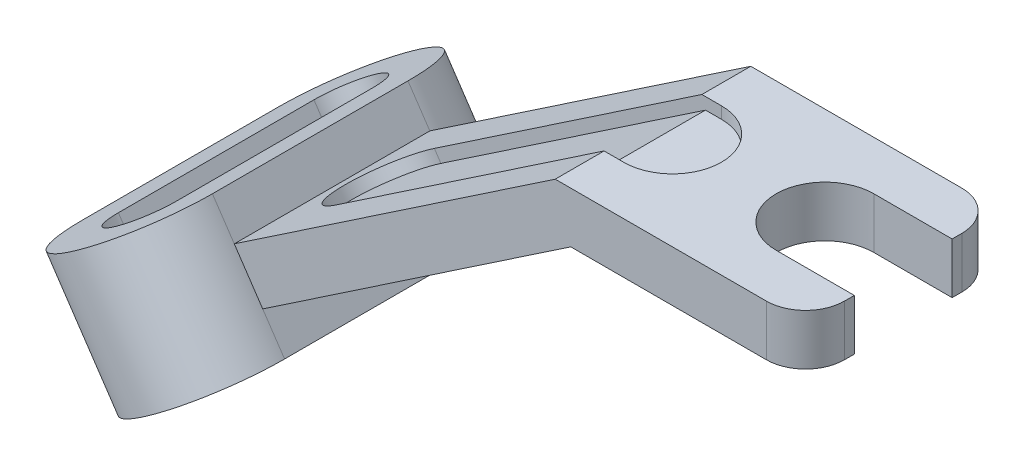
ISO-10303-21;
HEADER;
FILE_DESCRIPTION(('STEP AP214'),'2;1');
FILE_NAME('part.step','',(''),(''),'','','');
FILE_SCHEMA(('AUTOMOTIVE_DESIGN { 1 0 10303 214 1 1 1 1 }'));
ENDSEC;
DATA;
#1=APPLICATION_CONTEXT('core data for automotive mechanical design processes');
#2=APPLICATION_PROTOCOL_DEFINITION('international standard','automotive_design',2000,#1);
#3=PRODUCT_CONTEXT('',#1,'mechanical');
#4=PRODUCT('Part','Part','',(#3));
#5=PRODUCT_RELATED_PRODUCT_CATEGORY('part','',(#4));
#6=PRODUCT_DEFINITION_FORMATION('','',#4);
#7=PRODUCT_DEFINITION_CONTEXT('part definition',#1,'design');
#8=PRODUCT_DEFINITION('design','',#6,#7);
#9=PRODUCT_DEFINITION_SHAPE('','',#8);
#10=(LENGTH_UNIT() NAMED_UNIT(*) SI_UNIT(.MILLI.,.METRE.));
#11=(NAMED_UNIT(*) PLANE_ANGLE_UNIT() SI_UNIT($,.RADIAN.));
#12=(NAMED_UNIT(*) SI_UNIT($,.STERADIAN.) SOLID_ANGLE_UNIT());
#13=UNCERTAINTY_MEASURE_WITH_UNIT(LENGTH_MEASURE(1.E-05),#10,'distance_accuracy_value','');
#14=(GEOMETRIC_REPRESENTATION_CONTEXT(3) GLOBAL_UNCERTAINTY_ASSIGNED_CONTEXT((#13)) GLOBAL_UNIT_ASSIGNED_CONTEXT((#10,
#11,#12)) REPRESENTATION_CONTEXT('',''));
#15=CARTESIAN_POINT('',(0.,0.,0.));
#16=DIRECTION('',(0.,0.,1.));
#17=DIRECTION('',(1.,0.,0.));
#18=AXIS2_PLACEMENT_3D('',#15,#16,#17);
#19=CARTESIAN_POINT('',(-3.97449885896261,9.99999999999999,25.));
#20=DIRECTION('',(0.,1.,0.));
#21=DIRECTION('',(-1.,0.,0.));
#22=AXIS2_PLACEMENT_3D('',#19,#20,#21);
#23=PLANE('',#22);
#24=DIRECTION('',(-1.,0.,0.));
#25=VECTOR('',#24,1.);
#26=CARTESIAN_POINT('',(-3.97449885896261,9.99999999999999,12.5));
#27=LINE('',#26,#25);
#28=CARTESIAN_POINT('',(1.02550114103739,9.99999999999999,12.5));
#29=VERTEX_POINT('',#28);
#30=CARTESIAN_POINT('',(-3.05730681458663,10.,12.5));
#31=VERTEX_POINT('',#30);
#32=EDGE_CURVE('E264',#29,#31,#27,.T.);
#33=ORIENTED_EDGE('',*,*,#32,.T.);
#34=DIRECTION('',(0.,0.,1.));
#35=VECTOR('',#34,1.);
#36=CARTESIAN_POINT('',(-3.05730681458664,9.99999999999999,25.));
#37=LINE('',#36,#35);
#38=CARTESIAN_POINT('',(-3.05730681458663,10.,37.5));
#39=VERTEX_POINT('',#38);
#40=EDGE_CURVE('E252',#31,#39,#37,.T.);
#41=ORIENTED_EDGE('',*,*,#40,.T.);
#42=DIRECTION('',(1.,0.,0.));
#43=VECTOR('',#42,1.);
#44=CARTESIAN_POINT('',(-3.97449885896261,9.99999999999999,37.5));
#45=LINE('',#44,#43);
#46=CARTESIAN_POINT('',(1.02550114103739,9.99999999999999,37.5));
#47=VERTEX_POINT('',#46);
#48=EDGE_CURVE('E229',#39,#47,#45,.T.);
#49=ORIENTED_EDGE('',*,*,#48,.T.);
#50=CARTESIAN_POINT('',(1.02550114103739,9.99999999999999,25.));
#51=DIRECTION('',(0.,1.,0.));
#52=DIRECTION('',(-1.,0.,0.));
#53=AXIS2_PLACEMENT_3D('',#50,#51,#52);
#54=CIRCLE('',#53,12.5);
#55=EDGE_CURVE('E259',#47,#29,#54,.T.);
#56=ORIENTED_EDGE('',*,*,#55,.T.);
#57=EDGE_LOOP('',(#33,#41,#49,#56));
#58=FACE_BOUND('',#57,.T.);
#59=ADVANCED_FACE('F39',(#58),#23,.T.);
#60=CARTESIAN_POINT('',(60.,0.,50.));
#61=DIRECTION('',(-1.,0.,0.));
#62=DIRECTION('',(0.,0.,1.));
#63=AXIS2_PLACEMENT_3D('',#60,#61,#62);
#64=PLANE('',#63);
#65=DIRECTION('',(0.,0.,-1.));
#66=VECTOR('',#65,1.);
#67=CARTESIAN_POINT('',(60.,13.,50.));
#68=LINE('',#67,#66);
#69=CARTESIAN_POINT('',(60.,13.,40.));
#70=VERTEX_POINT('',#69);
#71=CARTESIAN_POINT('',(60.,13.,37.5));
#72=VERTEX_POINT('',#71);
#73=EDGE_CURVE('E444',#70,#72,#68,.T.);
#74=ORIENTED_EDGE('',*,*,#73,.F.);
#75=DIRECTION('',(0.,1.,0.));
#76=VECTOR('',#75,1.);
#77=CARTESIAN_POINT('',(60.,0.,40.));
#78=LINE('',#77,#76);
#79=CARTESIAN_POINT('',(60.,0.,40.));
#80=VERTEX_POINT('',#79);
#81=EDGE_CURVE('E11',#70,#80,#78,.F.);
#82=ORIENTED_EDGE('',*,*,#81,.T.);
#83=DIRECTION('',(0.,0.,-1.));
#84=VECTOR('',#83,1.);
#85=CARTESIAN_POINT('',(60.,0.,50.));
#86=LINE('',#85,#84);
#87=CARTESIAN_POINT('',(60.,0.,37.5));
#88=VERTEX_POINT('',#87);
#89=EDGE_CURVE('E431',#80,#88,#86,.T.);
#90=ORIENTED_EDGE('',*,*,#89,.T.);
#91=DIRECTION('',(0.,1.,0.));
#92=VECTOR('',#91,1.);
#93=CARTESIAN_POINT('',(60.,-83.7814176941014,37.5));
#94=LINE('',#93,#92);
#95=EDGE_CURVE('E301',#88,#72,#94,.T.);
#96=ORIENTED_EDGE('',*,*,#95,.T.);
#97=EDGE_LOOP('',(#74,#82,#90,#96));
#98=FACE_BOUND('',#97,.T.);
#99=ADVANCED_FACE('F552',(#98),#64,.F.);
#100=CARTESIAN_POINT('',(-3.97449885896261,13.,50.));
#101=DIRECTION('',(0.559192903470748,-0.829037572555041,0.));
#102=DIRECTION('',(0.829037572555041,0.559192903470748,0.));
#103=AXIS2_PLACEMENT_3D('',#100,#101,#102);
#104=PLANE('',#103);
#105=CARTESIAN_POINT('',(-72.3700985947535,-33.1334145363367,25.));
#106=DIRECTION('',(-0.559192903470748,0.829037572555041,0.));
#107=DIRECTION('',(-0.829037572555041,-0.559192903470748,0.));
#108=AXIS2_PLACEMENT_3D('',#105,#106,#107);
#109=CIRCLE('',#108,12.5);
#110=CARTESIAN_POINT('',(-72.3700985947535,-33.1334145363367,12.5));
#111=VERTEX_POINT('',#110);
#112=CARTESIAN_POINT('',(-72.3700985947535,-33.1334145363367,37.5));
#113=VERTEX_POINT('',#112);
#114=EDGE_CURVE('E218',#111,#113,#109,.T.);
#115=ORIENTED_EDGE('',*,*,#114,.F.);
#116=DIRECTION('',(-0.829037572555041,-0.559192903470748,0.));
#117=VECTOR('',#116,1.);
#118=CARTESIAN_POINT('',(-72.3700985947535,-33.1334145363367,12.5));
#119=LINE('',#118,#117);
#120=CARTESIAN_POINT('',(-3.97449885896261,13.,12.5));
#121=VERTEX_POINT('',#120);
#122=EDGE_CURVE('E238',#121,#111,#119,.T.);
#123=ORIENTED_EDGE('',*,*,#122,.F.);
#124=DIRECTION('',(0.,0.,-1.));
#125=VECTOR('',#124,1.);
#126=CARTESIAN_POINT('',(-3.97449885896261,13.,50.));
#127=LINE('',#126,#125);
#128=CARTESIAN_POINT('',(-3.97449885896261,13.,0.));
#129=VERTEX_POINT('',#128);
#130=EDGE_CURVE('E438',#121,#129,#127,.T.);
#131=ORIENTED_EDGE('',*,*,#130,.T.);
#132=DIRECTION('',(-0.829037572555041,-0.559192903470748,0.));
#133=VECTOR('',#132,1.);
#134=CARTESIAN_POINT('',(-3.97449885896261,13.,0.));
#135=LINE('',#134,#133);
#136=CARTESIAN_POINT('',(-86.0280771378486,-42.3458373865056,0.));
#137=VERTEX_POINT('',#136);
#138=EDGE_CURVE('E422',#129,#137,#135,.T.);
#139=ORIENTED_EDGE('',*,*,#138,.T.);
#140=DIRECTION('',(0.,0.,-1.));
#141=VECTOR('',#140,1.);
#142=CARTESIAN_POINT('',(-86.0280771378486,-42.3458373865056,50.));
#143=LINE('',#142,#141);
#144=CARTESIAN_POINT('',(-86.0280771378486,-42.3458373865056,50.));
#145=VERTEX_POINT('',#144);
#146=EDGE_CURVE('E399',#145,#137,#143,.T.);
#147=ORIENTED_EDGE('',*,*,#146,.F.);
#148=DIRECTION('',(-0.829037572555041,-0.559192903470748,0.));
#149=VECTOR('',#148,1.);
#150=CARTESIAN_POINT('',(-3.97449885896261,13.,50.));
#151=LINE('',#150,#149);
#152=CARTESIAN_POINT('',(-3.97449885896261,13.,50.));
#153=VERTEX_POINT('',#152);
#154=EDGE_CURVE('E407',#153,#145,#151,.T.);
#155=ORIENTED_EDGE('',*,*,#154,.F.);
#156=CARTESIAN_POINT('',(-3.97449885896261,13.,37.5));
#157=VERTEX_POINT('',#156);
#158=EDGE_CURVE('E439',#153,#157,#127,.T.);
#159=ORIENTED_EDGE('',*,*,#158,.T.);
#160=DIRECTION('',(0.829037572555041,0.559192903470748,0.));
#161=VECTOR('',#160,1.);
#162=CARTESIAN_POINT('',(-72.3700985947535,-33.1334145363367,37.5));
#163=LINE('',#162,#161);
#164=EDGE_CURVE('E242',#113,#157,#163,.T.);
#165=ORIENTED_EDGE('',*,*,#164,.F.);
#166=EDGE_LOOP('',(#115,#123,#131,#139,#147,#155,#159,#165));
#167=FACE_BOUND('',#166,.T.);
#168=ADVANCED_FACE('F497',(#167),#104,.F.);
#169=CARTESIAN_POINT('',(0.,0.,50.));
#170=DIRECTION('',(0.559192903470748,-0.829037572555041,0.));
#171=DIRECTION('',(0.829037572555041,0.559192903470748,0.));
#172=AXIS2_PLACEMENT_3D('',#169,#170,#171);
#173=PLANE('',#172);
#174=DIRECTION('',(-0.829037572555041,-0.559192903470748,0.));
#175=VECTOR('',#174,1.);
#176=CARTESIAN_POINT('',(0.,0.,50.));
#177=LINE('',#176,#175);
#178=CARTESIAN_POINT('',(0.,0.,50.));
#179=VERTEX_POINT('',#178);
#180=CARTESIAN_POINT('',(-78.7585693927289,-53.1233258297211,50.));
#181=VERTEX_POINT('',#180);
#182=EDGE_CURVE('E412',#179,#181,#177,.T.);
#183=ORIENTED_EDGE('',*,*,#182,.T.);
#184=DIRECTION('',(0.,0.,-1.));
#185=VECTOR('',#184,1.);
#186=CARTESIAN_POINT('',(-78.7585693927289,-53.1233258297211,50.));
#187=LINE('',#186,#185);
#188=CARTESIAN_POINT('',(-78.7585693927289,-53.1233258297211,0.));
#189=VERTEX_POINT('',#188);
#190=EDGE_CURVE('E395',#181,#189,#187,.T.);
#191=ORIENTED_EDGE('',*,*,#190,.T.);
#192=DIRECTION('',(-0.829037572555041,-0.559192903470748,0.));
#193=VECTOR('',#192,1.);
#194=CARTESIAN_POINT('',(0.,0.,0.));
#195=LINE('',#194,#193);
#196=CARTESIAN_POINT('',(0.,0.,0.));
#197=VERTEX_POINT('',#196);
#198=EDGE_CURVE('E426',#197,#189,#195,.T.);
#199=ORIENTED_EDGE('',*,*,#198,.F.);
#200=DIRECTION('',(0.,0.,-1.));
#201=VECTOR('',#200,1.);
#202=CARTESIAN_POINT('',(0.,0.,50.));
#203=LINE('',#202,#201);
#204=EDGE_CURVE('E434',#179,#197,#203,.T.);
#205=ORIENTED_EDGE('',*,*,#204,.F.);
#206=EDGE_LOOP('',(#183,#191,#199,#205));
#207=FACE_BOUND('',#206,.T.);
#208=ADVANCED_FACE('F538',(#207),#173,.T.);
#209=CARTESIAN_POINT('',(0.,0.,50.));
#210=DIRECTION('',(0.,0.,1.));
#211=DIRECTION('',(1.,0.,0.));
#212=AXIS2_PLACEMENT_3D('',#209,#210,#211);
#213=PLANE('',#212);
#214=DIRECTION('',(-1.,0.,0.));
#215=VECTOR('',#214,1.);
#216=CARTESIAN_POINT('',(60.,0.,50.));
#217=LINE('',#216,#215);
#218=CARTESIAN_POINT('',(50.,0.,50.));
#219=VERTEX_POINT('',#218);
#220=EDGE_CURVE('E416',#219,#179,#217,.T.);
#221=ORIENTED_EDGE('',*,*,#220,.F.);
#222=DIRECTION('',(0.,1.,0.));
#223=VECTOR('',#222,1.);
#224=CARTESIAN_POINT('',(50.,13.,50.));
#225=LINE('',#224,#223);
#226=CARTESIAN_POINT('',(50.,13.,50.));
#227=VERTEX_POINT('',#226);
#228=EDGE_CURVE('E48',#219,#227,#225,.T.);
#229=ORIENTED_EDGE('',*,*,#228,.T.);
#230=DIRECTION('',(-1.,0.,0.));
#231=VECTOR('',#230,1.);
#232=CARTESIAN_POINT('',(60.,13.,50.));
#233=LINE('',#232,#231);
#234=EDGE_CURVE('E404',#227,#153,#233,.T.);
#235=ORIENTED_EDGE('',*,*,#234,.T.);
#236=ORIENTED_EDGE('',*,*,#154,.T.);
#237=DIRECTION('',(-0.559192903470748,0.829037572555041,0.));
#238=VECTOR('',#237,1.);
#239=CARTESIAN_POINT('',(-73.1666403580214,-61.4137015552715,50.));
#240=LINE('',#239,#238);
#241=EDGE_CURVE('E390',#181,#145,#240,.T.);
#242=ORIENTED_EDGE('',*,*,#241,.F.);
#243=ORIENTED_EDGE('',*,*,#182,.F.);
#244=EDGE_LOOP('',(#221,#229,#235,#236,#242,#243));
#245=FACE_BOUND('',#244,.T.);
#246=ADVANCED_FACE('F486',(#245),#213,.T.);
#247=CARTESIAN_POINT('',(0.,0.,0.));
#248=DIRECTION('',(0.,0.,1.));
#249=DIRECTION('',(1.,0.,0.));
#250=AXIS2_PLACEMENT_3D('',#247,#248,#249);
#251=PLANE('',#250);
#252=DIRECTION('',(-1.,0.,0.));
#253=VECTOR('',#252,1.);
#254=CARTESIAN_POINT('',(60.,13.,0.));
#255=LINE('',#254,#253);
#256=CARTESIAN_POINT('',(50.,13.,0.));
#257=VERTEX_POINT('',#256);
#258=EDGE_CURVE('E403',#257,#129,#255,.T.);
#259=ORIENTED_EDGE('',*,*,#258,.F.);
#260=DIRECTION('',(0.,1.,0.));
#261=VECTOR('',#260,1.);
#262=CARTESIAN_POINT('',(50.,0.,0.));
#263=LINE('',#262,#261);
#264=CARTESIAN_POINT('',(50.,0.,0.));
#265=VERTEX_POINT('',#264);
#266=EDGE_CURVE('E474',#257,#265,#263,.F.);
#267=ORIENTED_EDGE('',*,*,#266,.T.);
#268=DIRECTION('',(-1.,0.,0.));
#269=VECTOR('',#268,1.);
#270=CARTESIAN_POINT('',(60.,0.,0.));
#271=LINE('',#270,#269);
#272=EDGE_CURVE('E408',#265,#197,#271,.T.);
#273=ORIENTED_EDGE('',*,*,#272,.T.);
#274=ORIENTED_EDGE('',*,*,#198,.T.);
#275=DIRECTION('',(0.559192903470748,-0.829037572555041,0.));
#276=VECTOR('',#275,1.);
#277=CARTESIAN_POINT('',(-78.7585693927289,-53.1233258297211,0.));
#278=LINE('',#277,#276);
#279=EDGE_CURVE('E450',#137,#189,#278,.T.);
#280=ORIENTED_EDGE('',*,*,#279,.F.);
#281=ORIENTED_EDGE('',*,*,#138,.F.);
#282=EDGE_LOOP('',(#259,#267,#273,#274,#280,#281));
#283=FACE_BOUND('',#282,.T.);
#284=ADVANCED_FACE('F532',(#283),#251,.F.);
#285=CARTESIAN_POINT('',(60.,0.,12.5));
#286=VERTEX_POINT('',#285);
#287=CARTESIAN_POINT('',(60.,0.,10.));
#288=VERTEX_POINT('',#287);
#289=EDGE_CURVE('E419',#286,#288,#86,.T.);
#290=ORIENTED_EDGE('',*,*,#289,.T.);
#291=DIRECTION('',(0.,1.,0.));
#292=VECTOR('',#291,1.);
#293=CARTESIAN_POINT('',(60.,0.,10.));
#294=LINE('',#293,#292);
#295=CARTESIAN_POINT('',(60.,13.,10.));
#296=VERTEX_POINT('',#295);
#297=EDGE_CURVE('E464',#288,#296,#294,.T.);
#298=ORIENTED_EDGE('',*,*,#297,.T.);
#299=CARTESIAN_POINT('',(60.,13.,12.5));
#300=VERTEX_POINT('',#299);
#301=EDGE_CURVE('E443',#300,#296,#68,.T.);
#302=ORIENTED_EDGE('',*,*,#301,.F.);
#303=DIRECTION('',(0.,1.,0.));
#304=VECTOR('',#303,1.);
#305=CARTESIAN_POINT('',(60.,-83.7814176941014,12.5));
#306=LINE('',#305,#304);
#307=EDGE_CURVE('E297',#286,#300,#306,.T.);
#308=ORIENTED_EDGE('',*,*,#307,.F.);
#309=EDGE_LOOP('',(#290,#298,#302,#308));
#310=FACE_BOUND('',#309,.T.);
#311=ADVANCED_FACE('F523',(#310),#64,.F.);
#312=CARTESIAN_POINT('',(60.,13.,50.));
#313=DIRECTION('',(0.,-1.,0.));
#314=DIRECTION('',(1.,0.,0.));
#315=AXIS2_PLACEMENT_3D('',#312,#313,#314);
#316=PLANE('',#315);
#317=ORIENTED_EDGE('',*,*,#301,.T.);
#318=CARTESIAN_POINT('',(50.,13.,10.));
#319=DIRECTION('',(0.,-1.,0.));
#320=DIRECTION('',(1.,0.,0.));
#321=AXIS2_PLACEMENT_3D('',#318,#319,#320);
#322=CIRCLE('',#321,10.);
#323=EDGE_CURVE('E471',#296,#257,#322,.F.);
#324=ORIENTED_EDGE('',*,*,#323,.T.);
#325=ORIENTED_EDGE('',*,*,#258,.T.);
#326=ORIENTED_EDGE('',*,*,#130,.F.);
#327=DIRECTION('',(-1.,0.,0.));
#328=VECTOR('',#327,1.);
#329=CARTESIAN_POINT('',(-3.97449885896261,13.,12.5));
#330=LINE('',#329,#328);
#331=CARTESIAN_POINT('',(1.02550114103739,13.,12.5));
#332=VERTEX_POINT('',#331);
#333=EDGE_CURVE('E260',#332,#121,#330,.T.);
#334=ORIENTED_EDGE('',*,*,#333,.F.);
#335=CARTESIAN_POINT('',(1.02550114103739,13.,25.));
#336=DIRECTION('',(0.,1.,0.));
#337=DIRECTION('',(-1.,0.,0.));
#338=AXIS2_PLACEMENT_3D('',#335,#336,#337);
#339=CIRCLE('',#338,12.5);
#340=CARTESIAN_POINT('',(1.02550114103739,13.,37.5));
#341=VERTEX_POINT('',#340);
#342=EDGE_CURVE('E272',#341,#332,#339,.T.);
#343=ORIENTED_EDGE('',*,*,#342,.F.);
#344=DIRECTION('',(1.,0.,0.));
#345=VECTOR('',#344,1.);
#346=CARTESIAN_POINT('',(-3.97449885896261,13.,37.5));
#347=LINE('',#346,#345);
#348=EDGE_CURVE('E256',#157,#341,#347,.T.);
#349=ORIENTED_EDGE('',*,*,#348,.F.);
#350=ORIENTED_EDGE('',*,*,#158,.F.);
#351=ORIENTED_EDGE('',*,*,#234,.F.);
#352=CARTESIAN_POINT('',(50.,13.,40.));
#353=DIRECTION('',(0.,-1.,0.));
#354=DIRECTION('',(1.,0.,0.));
#355=AXIS2_PLACEMENT_3D('',#352,#353,#354);
#356=CIRCLE('',#355,10.);
#357=EDGE_CURVE('E468',#227,#70,#356,.F.);
#358=ORIENTED_EDGE('',*,*,#357,.T.);
#359=ORIENTED_EDGE('',*,*,#73,.T.);
#360=DIRECTION('',(-1.,0.,0.));
#361=VECTOR('',#360,1.);
#362=CARTESIAN_POINT('',(0.,13.,37.5));
#363=LINE('',#362,#361);
#364=CARTESIAN_POINT('',(40.,13.,37.5));
#365=VERTEX_POINT('',#364);
#366=EDGE_CURVE('E292',#72,#365,#363,.T.);
#367=ORIENTED_EDGE('',*,*,#366,.T.);
#368=CARTESIAN_POINT('',(40.,13.,25.));
#369=DIRECTION('',(0.,1.,0.));
#370=DIRECTION('',(-1.,0.,0.));
#371=AXIS2_PLACEMENT_3D('',#368,#369,#370);
#372=CIRCLE('',#371,12.5);
#373=CARTESIAN_POINT('',(40.,13.,12.5));
#374=VERTEX_POINT('',#373);
#375=EDGE_CURVE('E288',#374,#365,#372,.T.);
#376=ORIENTED_EDGE('',*,*,#375,.F.);
#377=DIRECTION('',(-1.,0.,0.));
#378=VECTOR('',#377,1.);
#379=CARTESIAN_POINT('',(0.,13.,12.5));
#380=LINE('',#379,#378);
#381=EDGE_CURVE('E282',#300,#374,#380,.T.);
#382=ORIENTED_EDGE('',*,*,#381,.F.);
#383=EDGE_LOOP('',(#317,#324,#325,#326,#334,#343,#349,#350,#351,#358,#359,#367,#376,#382));
#384=FACE_BOUND('',#383,.T.);
#385=ADVANCED_FACE('F492',(#384),#316,.F.);
#386=CARTESIAN_POINT('',(60.,0.,50.));
#387=DIRECTION('',(0.,-1.,0.));
#388=DIRECTION('',(0.,0.,-1.));
#389=AXIS2_PLACEMENT_3D('',#386,#387,#388);
#390=PLANE('',#389);
#391=ORIENTED_EDGE('',*,*,#272,.F.);
#392=CARTESIAN_POINT('',(50.,0.,10.));
#393=DIRECTION('',(0.,-1.,0.));
#394=DIRECTION('',(0.,0.,-1.));
#395=AXIS2_PLACEMENT_3D('',#392,#393,#394);
#396=CIRCLE('',#395,10.);
#397=EDGE_CURVE('E479',#265,#288,#396,.T.);
#398=ORIENTED_EDGE('',*,*,#397,.T.);
#399=ORIENTED_EDGE('',*,*,#289,.F.);
#400=DIRECTION('',(1.,0.,0.));
#401=VECTOR('',#400,1.);
#402=CARTESIAN_POINT('',(60.,0.,12.5));
#403=LINE('',#402,#401);
#404=CARTESIAN_POINT('',(40.,0.,12.5));
#405=VERTEX_POINT('',#404);
#406=EDGE_CURVE('E461',#405,#286,#403,.T.);
#407=ORIENTED_EDGE('',*,*,#406,.F.);
#408=CARTESIAN_POINT('',(40.,0.,25.));
#409=DIRECTION('',(0.,-1.,0.));
#410=DIRECTION('',(0.,0.,-1.));
#411=AXIS2_PLACEMENT_3D('',#408,#409,#410);
#412=CIRCLE('',#411,12.5);
#413=CARTESIAN_POINT('',(40.,0.,37.5));
#414=VERTEX_POINT('',#413);
#415=EDGE_CURVE('E454',#414,#405,#412,.T.);
#416=ORIENTED_EDGE('',*,*,#415,.F.);
#417=DIRECTION('',(1.,0.,0.));
#418=VECTOR('',#417,1.);
#419=CARTESIAN_POINT('',(60.,0.,37.5));
#420=LINE('',#419,#418);
#421=EDGE_CURVE('E457',#414,#88,#420,.T.);
#422=ORIENTED_EDGE('',*,*,#421,.T.);
#423=ORIENTED_EDGE('',*,*,#89,.F.);
#424=CARTESIAN_POINT('',(50.,0.,40.));
#425=DIRECTION('',(0.,-1.,0.));
#426=DIRECTION('',(0.,0.,-1.));
#427=AXIS2_PLACEMENT_3D('',#424,#425,#426);
#428=CIRCLE('',#427,10.);
#429=EDGE_CURVE('E55',#80,#219,#428,.T.);
#430=ORIENTED_EDGE('',*,*,#429,.T.);
#431=ORIENTED_EDGE('',*,*,#220,.T.);
#432=ORIENTED_EDGE('',*,*,#204,.T.);
#433=EDGE_LOOP('',(#391,#398,#399,#407,#416,#422,#423,#430,#431,#432));
#434=FACE_BOUND('',#433,.T.);
#435=ADVANCED_FACE('F534',(#434),#390,.T.);
#436=CARTESIAN_POINT('',(-73.1666403580214,-61.4137015552715,0.));
#437=DIRECTION('',(-0.829037572555041,-0.559192903470748,0.));
#438=DIRECTION('',(0.559192903470748,-0.829037572555041,0.));
#439=AXIS2_PLACEMENT_3D('',#436,#437,#438);
#440=PLANE('',#439);
#441=CARTESIAN_POINT('',(-91.6200061725561,-34.0554616609552,50.));
#442=VERTEX_POINT('',#441);
#443=EDGE_CURVE('E384',#145,#442,#240,.T.);
#444=ORIENTED_EDGE('',*,*,#443,.F.);
#445=ORIENTED_EDGE('',*,*,#146,.T.);
#446=DIRECTION('',(-0.559192903470748,0.829037572555041,0.));
#447=VECTOR('',#446,1.);
#448=CARTESIAN_POINT('',(-73.1666403580214,-61.4137015552715,0.));
#449=LINE('',#448,#447);
#450=CARTESIAN_POINT('',(-91.6200061725561,-34.0554616609552,0.));
#451=VERTEX_POINT('',#450);
#452=EDGE_CURVE('E389',#137,#451,#449,.T.);
#453=ORIENTED_EDGE('',*,*,#452,.T.);
#454=DIRECTION('',(0.,0.,1.));
#455=VECTOR('',#454,1.);
#456=CARTESIAN_POINT('',(-91.6200061725561,-34.0554616609552,0.));
#457=LINE('',#456,#455);
#458=EDGE_CURVE('E368',#451,#442,#457,.T.);
#459=ORIENTED_EDGE('',*,*,#458,.T.);
#460=EDGE_LOOP('',(#444,#445,#453,#459));
#461=FACE_BOUND('',#460,.T.);
#462=ADVANCED_FACE('F501',(#461),#440,.F.);
#463=CARTESIAN_POINT('',(-82.2860536561268,-67.5648234934497,50.));
#464=DIRECTION('',(-0.829037572555041,-0.559192903470748,0.));
#465=DIRECTION('',(0.559192903470748,-0.829037572555041,0.));
#466=AXIS2_PLACEMENT_3D('',#463,#464,#465);
#467=PLANE('',#466);
#468=DIRECTION('',(0.,0.,1.));
#469=VECTOR('',#468,1.);
#470=CARTESIAN_POINT('',(-100.739419470662,-40.2065835991334,50.));
#471=LINE('',#470,#469);
#472=CARTESIAN_POINT('',(-100.739419470662,-40.2065835991334,0.));
#473=VERTEX_POINT('',#472);
#474=CARTESIAN_POINT('',(-100.739419470662,-40.2065835991334,50.));
#475=VERTEX_POINT('',#474);
#476=EDGE_CURVE('E314',#473,#475,#471,.T.);
#477=ORIENTED_EDGE('',*,*,#476,.F.);
#478=DIRECTION('',(0.559192903470748,-0.829037572555041,0.));
#479=VECTOR('',#478,1.);
#480=CARTESIAN_POINT('',(-87.8779826908343,-59.2744477678993,0.));
#481=LINE('',#480,#479);
#482=CARTESIAN_POINT('',(-82.2860536561268,-67.5648234934497,0.));
#483=VERTEX_POINT('',#482);
#484=EDGE_CURVE('E447',#473,#483,#481,.T.);
#485=ORIENTED_EDGE('',*,*,#484,.T.);
#486=DIRECTION('',(0.,0.,1.));
#487=VECTOR('',#486,1.);
#488=CARTESIAN_POINT('',(-82.2860536561268,-67.5648234934497,50.));
#489=LINE('',#488,#487);
#490=CARTESIAN_POINT('',(-82.2860536561268,-67.5648234934497,50.));
#491=VERTEX_POINT('',#490);
#492=EDGE_CURVE('E321',#483,#491,#489,.T.);
#493=ORIENTED_EDGE('',*,*,#492,.T.);
#494=DIRECTION('',(-0.559192903470748,0.829037572555041,0.));
#495=VECTOR('',#494,1.);
#496=CARTESIAN_POINT('',(-82.2860536561268,-67.5648234934497,50.));
#497=LINE('',#496,#495);
#498=EDGE_CURVE('E325',#491,#475,#497,.T.);
#499=ORIENTED_EDGE('',*,*,#498,.T.);
#500=EDGE_LOOP('',(#477,#485,#493,#499));
#501=FACE_BOUND('',#500,.T.);
#502=ADVANCED_FACE('F580',(#501),#467,.T.);
#503=CARTESIAN_POINT('',(-89.7473918091222,-72.5975596246865,0.));
#504=DIRECTION('',(0.559192903470748,-0.829037572555041,0.));
#505=DIRECTION('',(0.829037572555041,0.559192903470748,0.));
#506=AXIS2_PLACEMENT_3D('',#503,#504,#505);
#507=PLANE('',#506);
#508=CARTESIAN_POINT('',(-89.7473918091222,-72.5975596246865,0.));
#509=DIRECTION('',(0.559192903470748,-0.829037572555041,0.));
#510=DIRECTION('',(0.829037572555041,0.559192903470748,0.));
#511=AXIS2_PLACEMENT_3D('',#508,#509,#510);
#512=CIRCLE('',#511,20.);
#513=CARTESIAN_POINT('',(-106.328143260223,-83.7814176941014,0.));
#514=VERTEX_POINT('',#513);
#515=CARTESIAN_POINT('',(-73.1666403580214,-61.4137015552715,0.));
#516=VERTEX_POINT('',#515);
#517=EDGE_CURVE('E350',#514,#516,#512,.T.);
#518=ORIENTED_EDGE('',*,*,#517,.T.);
#519=DIRECTION('',(0.,0.,1.));
#520=VECTOR('',#519,1.);
#521=CARTESIAN_POINT('',(-73.1666403580214,-61.4137015552715,0.));
#522=LINE('',#521,#520);
#523=CARTESIAN_POINT('',(-73.1666403580214,-61.4137015552715,50.));
#524=VERTEX_POINT('',#523);
#525=EDGE_CURVE('E354',#516,#524,#522,.T.);
#526=ORIENTED_EDGE('',*,*,#525,.T.);
#527=CARTESIAN_POINT('',(-89.7473918091222,-72.5975596246865,50.));
#528=DIRECTION('',(0.559192903470748,-0.829037572555041,0.));
#529=DIRECTION('',(0.829037572555041,0.559192903470748,0.));
#530=AXIS2_PLACEMENT_3D('',#527,#528,#529);
#531=CIRCLE('',#530,20.);
#532=CARTESIAN_POINT('',(-106.328143260223,-83.7814176941014,50.));
#533=VERTEX_POINT('',#532);
#534=EDGE_CURVE('E358',#524,#533,#531,.T.);
#535=ORIENTED_EDGE('',*,*,#534,.T.);
#536=DIRECTION('',(0.,0.,-1.));
#537=VECTOR('',#536,1.);
#538=CARTESIAN_POINT('',(-106.328143260223,-83.7814176941014,0.));
#539=LINE('',#538,#537);
#540=EDGE_CURVE('E361',#533,#514,#539,.T.);
#541=ORIENTED_EDGE('',*,*,#540,.T.);
#542=EDGE_LOOP('',(#518,#526,#535,#541));
#543=FACE_BOUND('',#542,.T.);
#544=DIRECTION('',(0.,0.,-1.));
#545=VECTOR('',#544,1.);
#546=CARTESIAN_POINT('',(-97.2087299621176,-77.6302957559232,50.));
#547=LINE('',#546,#545);
#548=CARTESIAN_POINT('',(-97.2087299621176,-77.6302957559232,50.));
#549=VERTEX_POINT('',#548);
#550=CARTESIAN_POINT('',(-97.2087299621176,-77.6302957559232,0.));
#551=VERTEX_POINT('',#550);
#552=EDGE_CURVE('E313',#549,#551,#547,.T.);
#553=ORIENTED_EDGE('',*,*,#552,.F.);
#554=CARTESIAN_POINT('',(-89.7473918091222,-72.5975596246865,50.));
#555=DIRECTION('',(0.559192903470748,-0.829037572555041,0.));
#556=DIRECTION('',(0.829037572555041,0.559192903470748,0.));
#557=AXIS2_PLACEMENT_3D('',#554,#555,#556);
#558=CIRCLE('',#557,9.);
#559=EDGE_CURVE('E310',#491,#549,#558,.T.);
#560=ORIENTED_EDGE('',*,*,#559,.F.);
#561=ORIENTED_EDGE('',*,*,#492,.F.);
#562=CARTESIAN_POINT('',(-89.7473918091222,-72.5975596246865,0.));
#563=DIRECTION('',(0.559192903470748,-0.829037572555041,0.));
#564=DIRECTION('',(0.829037572555041,0.559192903470748,0.));
#565=AXIS2_PLACEMENT_3D('',#562,#563,#564);
#566=CIRCLE('',#565,9.);
#567=EDGE_CURVE('E317',#551,#483,#566,.T.);
#568=ORIENTED_EDGE('',*,*,#567,.F.);
#569=EDGE_LOOP('',(#553,#560,#561,#568));
#570=FACE_BOUND('',#569,.T.);
#571=ADVANCED_FACE('F583',(#543,#570),#507,.T.);
#572=CARTESIAN_POINT('',(-108.200757623657,-45.2393197303701,0.));
#573=DIRECTION('',(0.559192903470748,-0.829037572555041,0.));
#574=DIRECTION('',(0.829037572555041,0.559192903470748,0.));
#575=AXIS2_PLACEMENT_3D('',#572,#573,#574);
#576=PLANE('',#575);
#577=CARTESIAN_POINT('',(-108.200757623657,-45.2393197303701,0.));
#578=DIRECTION('',(0.559192903470748,-0.829037572555041,0.));
#579=DIRECTION('',(0.829037572555041,0.559192903470748,0.));
#580=AXIS2_PLACEMENT_3D('',#577,#578,#579);
#581=CIRCLE('',#580,20.);
#582=CARTESIAN_POINT('',(-124.781509074758,-56.4231777997851,0.));
#583=VERTEX_POINT('',#582);
#584=EDGE_CURVE('E349',#583,#451,#581,.T.);
#585=ORIENTED_EDGE('',*,*,#584,.F.);
#586=DIRECTION('',(0.,0.,-1.));
#587=VECTOR('',#586,1.);
#588=CARTESIAN_POINT('',(-124.781509074758,-56.4231777997851,0.));
#589=LINE('',#588,#587);
#590=CARTESIAN_POINT('',(-124.781509074758,-56.4231777997851,50.));
#591=VERTEX_POINT('',#590);
#592=EDGE_CURVE('E355',#591,#583,#589,.T.);
#593=ORIENTED_EDGE('',*,*,#592,.F.);
#594=CARTESIAN_POINT('',(-108.200757623657,-45.2393197303701,50.));
#595=DIRECTION('',(0.559192903470748,-0.829037572555041,0.));
#596=DIRECTION('',(0.829037572555041,0.559192903470748,0.));
#597=AXIS2_PLACEMENT_3D('',#594,#595,#596);
#598=CIRCLE('',#597,20.);
#599=EDGE_CURVE('E372',#442,#591,#598,.T.);
#600=ORIENTED_EDGE('',*,*,#599,.F.);
#601=ORIENTED_EDGE('',*,*,#458,.F.);
#602=EDGE_LOOP('',(#585,#593,#600,#601));
#603=FACE_BOUND('',#602,.T.);
#604=CARTESIAN_POINT('',(-108.200757623657,-45.2393197303701,50.));
#605=DIRECTION('',(0.559192903470748,-0.829037572555041,0.));
#606=DIRECTION('',(0.829037572555041,0.559192903470748,0.));
#607=AXIS2_PLACEMENT_3D('',#604,#605,#606);
#608=CIRCLE('',#607,9.);
#609=CARTESIAN_POINT('',(-115.662095776652,-50.2720558616069,50.));
#610=VERTEX_POINT('',#609);
#611=EDGE_CURVE('E300',#475,#610,#608,.T.);
#612=ORIENTED_EDGE('',*,*,#611,.T.);
#613=DIRECTION('',(0.,0.,-1.));
#614=VECTOR('',#613,1.);
#615=CARTESIAN_POINT('',(-115.662095776652,-50.2720558616069,50.));
#616=LINE('',#615,#614);
#617=CARTESIAN_POINT('',(-115.662095776652,-50.2720558616069,0.));
#618=VERTEX_POINT('',#617);
#619=EDGE_CURVE('E329',#610,#618,#616,.T.);
#620=ORIENTED_EDGE('',*,*,#619,.T.);
#621=CARTESIAN_POINT('',(-108.200757623657,-45.2393197303701,0.));
#622=DIRECTION('',(0.559192903470748,-0.829037572555041,0.));
#623=DIRECTION('',(0.829037572555041,0.559192903470748,0.));
#624=AXIS2_PLACEMENT_3D('',#621,#622,#623);
#625=CIRCLE('',#624,9.);
#626=EDGE_CURVE('E333',#618,#473,#625,.T.);
#627=ORIENTED_EDGE('',*,*,#626,.T.);
#628=ORIENTED_EDGE('',*,*,#476,.T.);
#629=EDGE_LOOP('',(#612,#620,#627,#628));
#630=FACE_BOUND('',#629,.T.);
#631=ADVANCED_FACE('F599',(#603,#630),#576,.F.);
#632=CARTESIAN_POINT('',(-89.7473918091222,-72.5975596246865,0.));
#633=DIRECTION('',(-0.559192903470748,0.829037572555041,0.));
#634=DIRECTION('',(-0.829037572555041,-0.559192903470748,0.));
#635=AXIS2_PLACEMENT_3D('',#632,#633,#634);
#636=CYLINDRICAL_SURFACE('',#635,20.);
#637=ORIENTED_EDGE('',*,*,#584,.T.);
#638=ORIENTED_EDGE('',*,*,#452,.F.);
#639=ORIENTED_EDGE('',*,*,#279,.T.);
#640=EDGE_CURVE('E391',#516,#189,#449,.T.);
#641=ORIENTED_EDGE('',*,*,#640,.F.);
#642=ORIENTED_EDGE('',*,*,#517,.F.);
#643=DIRECTION('',(-0.559192903470748,0.829037572555041,0.));
#644=VECTOR('',#643,1.);
#645=CARTESIAN_POINT('',(-106.328143260223,-83.7814176941014,0.));
#646=LINE('',#645,#644);
#647=EDGE_CURVE('E364',#514,#583,#646,.T.);
#648=ORIENTED_EDGE('',*,*,#647,.T.);
#649=EDGE_LOOP('',(#637,#638,#639,#641,#642,#648));
#650=FACE_BOUND('',#649,.T.);
#651=ADVANCED_FACE('F603',(#650),#636,.T.);
#652=ORIENTED_EDGE('',*,*,#190,.F.);
#653=EDGE_CURVE('E385',#524,#181,#240,.T.);
#654=ORIENTED_EDGE('',*,*,#653,.F.);
#655=ORIENTED_EDGE('',*,*,#525,.F.);
#656=ORIENTED_EDGE('',*,*,#640,.T.);
#657=EDGE_LOOP('',(#652,#654,#655,#656));
#658=FACE_BOUND('',#657,.T.);
#659=ADVANCED_FACE('F610',(#658),#440,.F.);
#660=CARTESIAN_POINT('',(-89.7473918091222,-72.5975596246865,50.));
#661=DIRECTION('',(-0.559192903470748,0.829037572555041,0.));
#662=DIRECTION('',(-0.829037572555041,-0.559192903470748,0.));
#663=AXIS2_PLACEMENT_3D('',#660,#661,#662);
#664=CYLINDRICAL_SURFACE('',#663,20.);
#665=ORIENTED_EDGE('',*,*,#599,.T.);
#666=DIRECTION('',(-0.559192903470748,0.829037572555041,0.));
#667=VECTOR('',#666,1.);
#668=CARTESIAN_POINT('',(-106.328143260223,-83.7814176941014,50.));
#669=LINE('',#668,#667);
#670=EDGE_CURVE('E380',#533,#591,#669,.T.);
#671=ORIENTED_EDGE('',*,*,#670,.F.);
#672=ORIENTED_EDGE('',*,*,#534,.F.);
#673=ORIENTED_EDGE('',*,*,#653,.T.);
#674=ORIENTED_EDGE('',*,*,#241,.T.);
#675=ORIENTED_EDGE('',*,*,#443,.T.);
#676=EDGE_LOOP('',(#665,#671,#672,#673,#674,#675));
#677=FACE_BOUND('',#676,.T.);
#678=ADVANCED_FACE('F507',(#677),#664,.T.);
#679=CARTESIAN_POINT('',(-106.328143260223,-83.7814176941014,0.));
#680=DIRECTION('',(0.829037572555041,0.559192903470748,0.));
#681=DIRECTION('',(-0.559192903470748,0.829037572555041,0.));
#682=AXIS2_PLACEMENT_3D('',#679,#680,#681);
#683=PLANE('',#682);
#684=ORIENTED_EDGE('',*,*,#592,.T.);
#685=ORIENTED_EDGE('',*,*,#647,.F.);
#686=ORIENTED_EDGE('',*,*,#540,.F.);
#687=ORIENTED_EDGE('',*,*,#670,.T.);
#688=EDGE_LOOP('',(#684,#685,#686,#687));
#689=FACE_BOUND('',#688,.T.);
#690=ADVANCED_FACE('F595',(#689),#683,.F.);
#691=CARTESIAN_POINT('',(-89.7473918091222,-72.5975596246865,50.));
#692=DIRECTION('',(-0.559192903470748,0.829037572555041,0.));
#693=DIRECTION('',(-0.829037572555041,-0.559192903470748,0.));
#694=AXIS2_PLACEMENT_3D('',#691,#692,#693);
#695=CYLINDRICAL_SURFACE('',#694,9.);
#696=ORIENTED_EDGE('',*,*,#611,.F.);
#697=ORIENTED_EDGE('',*,*,#498,.F.);
#698=ORIENTED_EDGE('',*,*,#559,.T.);
#699=DIRECTION('',(-0.559192903470748,0.829037572555041,0.));
#700=VECTOR('',#699,1.);
#701=CARTESIAN_POINT('',(-97.2087299621176,-77.6302957559232,50.));
#702=LINE('',#701,#700);
#703=EDGE_CURVE('E345',#549,#610,#702,.T.);
#704=ORIENTED_EDGE('',*,*,#703,.T.);
#705=EDGE_LOOP('',(#696,#697,#698,#704));
#706=FACE_BOUND('',#705,.T.);
#707=ADVANCED_FACE('F591',(#706),#695,.F.);
#708=CARTESIAN_POINT('',(-97.2087299621176,-77.6302957559232,50.));
#709=DIRECTION('',(0.829037572555041,0.559192903470748,0.));
#710=DIRECTION('',(-0.559192903470748,0.829037572555041,0.));
#711=AXIS2_PLACEMENT_3D('',#708,#709,#710);
#712=PLANE('',#711);
#713=ORIENTED_EDGE('',*,*,#619,.F.);
#714=ORIENTED_EDGE('',*,*,#703,.F.);
#715=ORIENTED_EDGE('',*,*,#552,.T.);
#716=DIRECTION('',(-0.559192903470748,0.829037572555041,0.));
#717=VECTOR('',#716,1.);
#718=CARTESIAN_POINT('',(-97.2087299621176,-77.6302957559232,0.));
#719=LINE('',#718,#717);
#720=EDGE_CURVE('E342',#551,#618,#719,.T.);
#721=ORIENTED_EDGE('',*,*,#720,.T.);
#722=EDGE_LOOP('',(#713,#714,#715,#721));
#723=FACE_BOUND('',#722,.T.);
#724=ADVANCED_FACE('F587',(#723),#712,.T.);
#725=CARTESIAN_POINT('',(-89.7473918091222,-72.5975596246865,0.));
#726=DIRECTION('',(-0.559192903470748,0.829037572555041,0.));
#727=DIRECTION('',(-0.829037572555041,-0.559192903470748,0.));
#728=AXIS2_PLACEMENT_3D('',#725,#726,#727);
#729=CYLINDRICAL_SURFACE('',#728,9.);
#730=ORIENTED_EDGE('',*,*,#626,.F.);
#731=ORIENTED_EDGE('',*,*,#720,.F.);
#732=ORIENTED_EDGE('',*,*,#567,.T.);
#733=ORIENTED_EDGE('',*,*,#484,.F.);
#734=EDGE_LOOP('',(#730,#731,#732,#733));
#735=FACE_BOUND('',#734,.T.);
#736=ADVANCED_FACE('F578',(#735),#729,.F.);
#737=CARTESIAN_POINT('',(0.,-83.7814176941014,12.5));
#738=DIRECTION('',(0.,0.,-1.));
#739=DIRECTION('',(-1.,0.,0.));
#740=AXIS2_PLACEMENT_3D('',#737,#738,#739);
#741=PLANE('',#740);
#742=ORIENTED_EDGE('',*,*,#381,.T.);
#743=DIRECTION('',(0.,1.,0.));
#744=VECTOR('',#743,1.);
#745=CARTESIAN_POINT('',(40.,-83.7814176941014,12.5));
#746=LINE('',#745,#744);
#747=EDGE_CURVE('E296',#405,#374,#746,.T.);
#748=ORIENTED_EDGE('',*,*,#747,.F.);
#749=ORIENTED_EDGE('',*,*,#406,.T.);
#750=ORIENTED_EDGE('',*,*,#307,.T.);
#751=EDGE_LOOP('',(#742,#748,#749,#750));
#752=FACE_BOUND('',#751,.T.);
#753=ADVANCED_FACE('F571',(#752),#741,.F.);
#754=CARTESIAN_POINT('',(0.,-83.7814176941014,37.5));
#755=DIRECTION('',(0.,0.,-1.));
#756=DIRECTION('',(-1.,0.,0.));
#757=AXIS2_PLACEMENT_3D('',#754,#755,#756);
#758=PLANE('',#757);
#759=ORIENTED_EDGE('',*,*,#366,.F.);
#760=ORIENTED_EDGE('',*,*,#95,.F.);
#761=ORIENTED_EDGE('',*,*,#421,.F.);
#762=DIRECTION('',(0.,1.,0.));
#763=VECTOR('',#762,1.);
#764=CARTESIAN_POINT('',(40.,-83.7814176941014,37.5));
#765=LINE('',#764,#763);
#766=EDGE_CURVE('E305',#414,#365,#765,.T.);
#767=ORIENTED_EDGE('',*,*,#766,.T.);
#768=EDGE_LOOP('',(#759,#760,#761,#767));
#769=FACE_BOUND('',#768,.T.);
#770=ADVANCED_FACE('F568',(#769),#758,.T.);
#771=CARTESIAN_POINT('',(40.,-83.7814176941014,25.));
#772=DIRECTION('',(0.,1.,0.));
#773=DIRECTION('',(-1.,0.,0.));
#774=AXIS2_PLACEMENT_3D('',#771,#772,#773);
#775=CYLINDRICAL_SURFACE('',#774,12.5);
#776=ORIENTED_EDGE('',*,*,#375,.T.);
#777=ORIENTED_EDGE('',*,*,#766,.F.);
#778=ORIENTED_EDGE('',*,*,#415,.T.);
#779=ORIENTED_EDGE('',*,*,#747,.T.);
#780=EDGE_LOOP('',(#776,#777,#778,#779));
#781=FACE_BOUND('',#780,.T.);
#782=ADVANCED_FACE('F563',(#781),#775,.F.);
#783=CARTESIAN_POINT('',(-3.97449885896261,9.99999999999999,12.5));
#784=DIRECTION('',(0.,0.,-1.));
#785=DIRECTION('',(-1.,0.,0.));
#786=AXIS2_PLACEMENT_3D('',#783,#784,#785);
#787=PLANE('',#786);
#788=ORIENTED_EDGE('',*,*,#333,.T.);
#789=ORIENTED_EDGE('',*,*,#122,.T.);
#790=DIRECTION('',(-0.559192903470748,0.829037572555041,0.));
#791=VECTOR('',#790,1.);
#792=CARTESIAN_POINT('',(-70.6925198843412,-35.6205272540019,12.5));
#793=LINE('',#792,#791);
#794=CARTESIAN_POINT('',(-70.6925198843412,-35.6205272540019,12.5));
#795=VERTEX_POINT('',#794);
#796=EDGE_CURVE('E222',#795,#111,#793,.T.);
#797=ORIENTED_EDGE('',*,*,#796,.F.);
#798=DIRECTION('',(-0.829037572555041,-0.559192903470748,0.));
#799=VECTOR('',#798,1.);
#800=CARTESIAN_POINT('',(-70.6925198843412,-35.6205272540019,12.5));
#801=LINE('',#800,#799);
#802=EDGE_CURVE('E223',#31,#795,#801,.T.);
#803=ORIENTED_EDGE('',*,*,#802,.F.);
#804=ORIENTED_EDGE('',*,*,#32,.F.);
#805=DIRECTION('',(0.,1.,0.));
#806=VECTOR('',#805,1.);
#807=CARTESIAN_POINT('',(1.02550114103739,9.99999999999999,12.5));
#808=LINE('',#807,#806);
#809=EDGE_CURVE('E279',#29,#332,#808,.T.);
#810=ORIENTED_EDGE('',*,*,#809,.T.);
#811=EDGE_LOOP('',(#788,#789,#797,#803,#804,#810));
#812=FACE_BOUND('',#811,.T.);
#813=ADVANCED_FACE('F545',(#812),#787,.F.);
#814=CARTESIAN_POINT('',(1.02550114103739,9.99999999999999,25.));
#815=DIRECTION('',(0.,1.,0.));
#816=DIRECTION('',(-1.,0.,0.));
#817=AXIS2_PLACEMENT_3D('',#814,#815,#816);
#818=CYLINDRICAL_SURFACE('',#817,12.5);
#819=ORIENTED_EDGE('',*,*,#342,.T.);
#820=ORIENTED_EDGE('',*,*,#809,.F.);
#821=ORIENTED_EDGE('',*,*,#55,.F.);
#822=DIRECTION('',(0.,1.,0.));
#823=VECTOR('',#822,1.);
#824=CARTESIAN_POINT('',(1.02550114103739,9.99999999999999,37.5));
#825=LINE('',#824,#823);
#826=EDGE_CURVE('E268',#47,#341,#825,.T.);
#827=ORIENTED_EDGE('',*,*,#826,.T.);
#828=EDGE_LOOP('',(#819,#820,#821,#827));
#829=FACE_BOUND('',#828,.T.);
#830=ADVANCED_FACE('F549',(#829),#818,.F.);
#831=CARTESIAN_POINT('',(-3.97449885896261,9.99999999999999,37.5));
#832=DIRECTION('',(0.,0.,1.));
#833=DIRECTION('',(1.,0.,0.));
#834=AXIS2_PLACEMENT_3D('',#831,#832,#833);
#835=PLANE('',#834);
#836=ORIENTED_EDGE('',*,*,#48,.F.);
#837=DIRECTION('',(0.829037572555041,0.559192903470748,0.));
#838=VECTOR('',#837,1.);
#839=CARTESIAN_POINT('',(-70.6925198843412,-35.6205272540019,37.5));
#840=LINE('',#839,#838);
#841=CARTESIAN_POINT('',(-70.6925198843412,-35.6205272540019,37.5));
#842=VERTEX_POINT('',#841);
#843=EDGE_CURVE('E226',#842,#39,#840,.T.);
#844=ORIENTED_EDGE('',*,*,#843,.F.);
#845=DIRECTION('',(-0.559192903470748,0.829037572555041,0.));
#846=VECTOR('',#845,1.);
#847=CARTESIAN_POINT('',(-70.6925198843412,-35.6205272540019,37.5));
#848=LINE('',#847,#846);
#849=EDGE_CURVE('E212',#842,#113,#848,.T.);
#850=ORIENTED_EDGE('',*,*,#849,.T.);
#851=ORIENTED_EDGE('',*,*,#164,.T.);
#852=ORIENTED_EDGE('',*,*,#348,.T.);
#853=ORIENTED_EDGE('',*,*,#826,.F.);
#854=EDGE_LOOP('',(#836,#844,#850,#851,#852,#853));
#855=FACE_BOUND('',#854,.T.);
#856=ADVANCED_FACE('F227',(#855),#835,.F.);
#857=CARTESIAN_POINT('',(-70.6925198843412,-35.6205272540019,25.));
#858=DIRECTION('',(-0.559192903470748,0.829037572555041,0.));
#859=DIRECTION('',(-0.829037572555041,-0.559192903470748,0.));
#860=AXIS2_PLACEMENT_3D('',#857,#858,#859);
#861=CYLINDRICAL_SURFACE('',#860,12.5);
#862=ORIENTED_EDGE('',*,*,#114,.T.);
#863=ORIENTED_EDGE('',*,*,#849,.F.);
#864=CARTESIAN_POINT('',(-70.6925198843412,-35.6205272540019,25.));
#865=DIRECTION('',(-0.559192903470748,0.829037572555041,0.));
#866=DIRECTION('',(-0.829037572555041,-0.559192903470748,0.));
#867=AXIS2_PLACEMENT_3D('',#864,#865,#866);
#868=CIRCLE('',#867,12.5);
#869=EDGE_CURVE('E216',#795,#842,#868,.T.);
#870=ORIENTED_EDGE('',*,*,#869,.F.);
#871=ORIENTED_EDGE('',*,*,#796,.T.);
#872=EDGE_LOOP('',(#862,#863,#870,#871));
#873=FACE_BOUND('',#872,.T.);
#874=ADVANCED_FACE('F214',(#873),#861,.F.);
#875=CARTESIAN_POINT('',(-70.6925198843412,-35.6205272540019,25.));
#876=DIRECTION('',(-0.559192903470748,0.829037572555041,0.));
#877=DIRECTION('',(-0.829037572555041,-0.559192903470748,0.));
#878=AXIS2_PLACEMENT_3D('',#875,#876,#877);
#879=PLANE('',#878);
#880=ORIENTED_EDGE('',*,*,#802,.T.);
#881=ORIENTED_EDGE('',*,*,#869,.T.);
#882=ORIENTED_EDGE('',*,*,#843,.T.);
#883=ORIENTED_EDGE('',*,*,#40,.F.);
#884=EDGE_LOOP('',(#880,#881,#882,#883));
#885=FACE_BOUND('',#884,.T.);
#886=ADVANCED_FACE('F234',(#885),#879,.T.);
#887=CARTESIAN_POINT('',(50.,0.,10.));
#888=DIRECTION('',(0.,1.,0.));
#889=DIRECTION('',(0.,0.,1.));
#890=AXIS2_PLACEMENT_3D('',#887,#888,#889);
#891=CYLINDRICAL_SURFACE('',#890,10.);
#892=ORIENTED_EDGE('',*,*,#397,.F.);
#893=ORIENTED_EDGE('',*,*,#266,.F.);
#894=ORIENTED_EDGE('',*,*,#323,.F.);
#895=ORIENTED_EDGE('',*,*,#297,.F.);
#896=EDGE_LOOP('',(#892,#893,#894,#895));
#897=FACE_BOUND('',#896,.T.);
#898=ADVANCED_FACE('F528',(#897),#891,.T.);
#899=CARTESIAN_POINT('',(50.,0.,40.));
#900=DIRECTION('',(0.,-1.,0.));
#901=DIRECTION('',(0.,0.,-1.));
#902=AXIS2_PLACEMENT_3D('',#899,#900,#901);
#903=CYLINDRICAL_SURFACE('',#902,10.);
#904=ORIENTED_EDGE('',*,*,#429,.F.);
#905=ORIENTED_EDGE('',*,*,#81,.F.);
#906=ORIENTED_EDGE('',*,*,#357,.F.);
#907=ORIENTED_EDGE('',*,*,#228,.F.);
#908=EDGE_LOOP('',(#904,#905,#906,#907));
#909=FACE_BOUND('',#908,.T.);
#910=ADVANCED_FACE('F41',(#909),#903,.T.);
#911=CLOSED_SHELL('',(#59,#99,#168,#208,#246,#284,#311,#385,#435,#462,#502,#571,#631,#651,#659,
#678,#690,#707,#724,#736,#753,#770,#782,#813,#830,#856,#874,#886,#898,#910));
#912=MANIFOLD_SOLID_BREP('B2',#911);
#913=ADVANCED_BREP_SHAPE_REPRESENTATION('',(#18,#912),#14);
#914=SHAPE_DEFINITION_REPRESENTATION(#9,#913);
ENDSEC;
END-ISO-10303-21;
